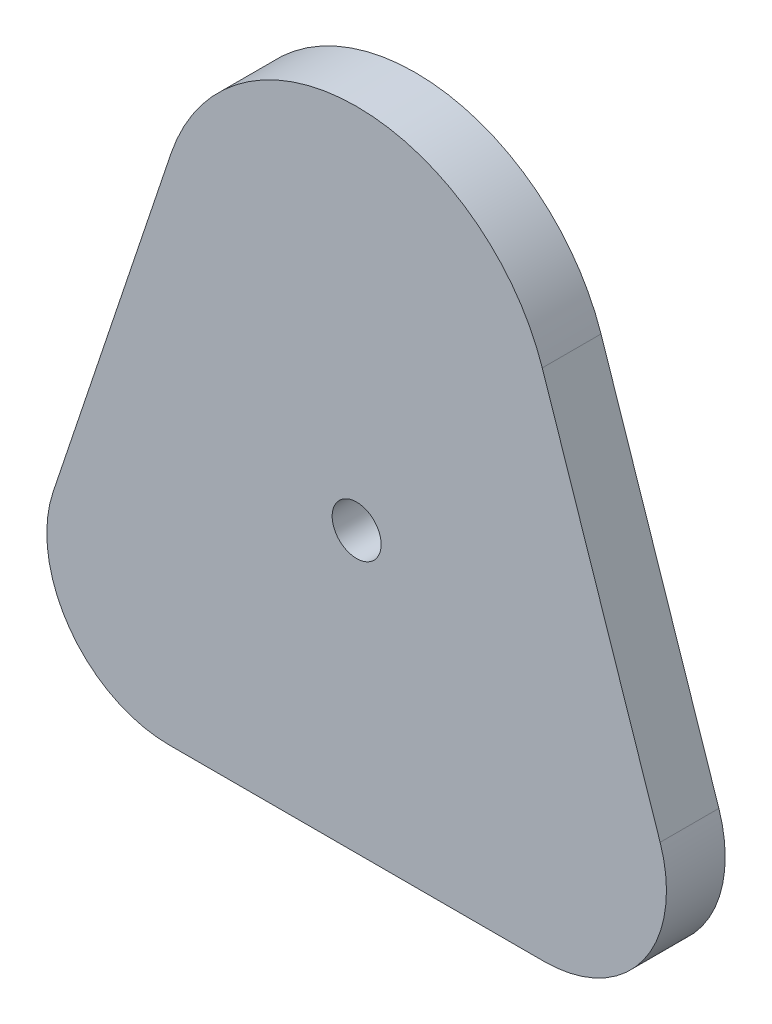
ISO-10303-21;
HEADER;
FILE_DESCRIPTION(('STEP AP214'),'2;1');
FILE_NAME('part.step','',(''),(''),'','','');
FILE_SCHEMA(('AUTOMOTIVE_DESIGN { 1 0 10303 214 1 1 1 1 }'));
ENDSEC;
DATA;
#1=APPLICATION_CONTEXT('core data for automotive mechanical design processes');
#2=APPLICATION_PROTOCOL_DEFINITION('international standard','automotive_design',2000,#1);
#3=PRODUCT_CONTEXT('',#1,'mechanical');
#4=PRODUCT('Part','Part','',(#3));
#5=PRODUCT_RELATED_PRODUCT_CATEGORY('part','',(#4));
#6=PRODUCT_DEFINITION_FORMATION('','',#4);
#7=PRODUCT_DEFINITION_CONTEXT('part definition',#1,'design');
#8=PRODUCT_DEFINITION('design','',#6,#7);
#9=PRODUCT_DEFINITION_SHAPE('','',#8);
#10=(LENGTH_UNIT() NAMED_UNIT(*) SI_UNIT(.MILLI.,.METRE.));
#11=(NAMED_UNIT(*) PLANE_ANGLE_UNIT() SI_UNIT($,.RADIAN.));
#12=(NAMED_UNIT(*) SI_UNIT($,.STERADIAN.) SOLID_ANGLE_UNIT());
#13=UNCERTAINTY_MEASURE_WITH_UNIT(LENGTH_MEASURE(1.E-05),#10,'distance_accuracy_value','');
#14=(GEOMETRIC_REPRESENTATION_CONTEXT(3) GLOBAL_UNCERTAINTY_ASSIGNED_CONTEXT((#13)) GLOBAL_UNIT_ASSIGNED_CONTEXT((#10,
#11,#12)) REPRESENTATION_CONTEXT('',''));
#15=CARTESIAN_POINT('',(0.,0.,0.));
#16=DIRECTION('',(0.,0.,1.));
#17=DIRECTION('',(1.,0.,0.));
#18=AXIS2_PLACEMENT_3D('',#15,#16,#17);
#19=CARTESIAN_POINT('',(0.,17.5,6.));
#20=DIRECTION('',(0.,0.,-1.));
#21=DIRECTION('',(-1.,0.,0.));
#22=AXIS2_PLACEMENT_3D('',#19,#20,#21);
#23=CYLINDRICAL_SURFACE('',#22,20.);
#24=CARTESIAN_POINT('',(0.,17.5,0.));
#25=DIRECTION('',(0.,0.,1.));
#26=DIRECTION('',(1.,0.,0.));
#27=AXIS2_PLACEMENT_3D('',#24,#25,#26);
#28=CIRCLE('',#27,20.);
#29=CARTESIAN_POINT('',(18.9648601114539,23.8509118205959,0.));
#30=VERTEX_POINT('',#29);
#31=CARTESIAN_POINT('',(-18.9648601114539,23.850911820596,0.));
#32=VERTEX_POINT('',#31);
#33=EDGE_CURVE('E126',#30,#32,#28,.T.);
#34=ORIENTED_EDGE('',*,*,#33,.T.);
#35=DIRECTION('',(0.,0.,-1.));
#36=VECTOR('',#35,1.);
#37=CARTESIAN_POINT('',(-18.9648601114539,23.850911820596,6.));
#38=LINE('',#37,#36);
#39=CARTESIAN_POINT('',(-18.9648601114539,23.850911820596,6.));
#40=VERTEX_POINT('',#39);
#41=EDGE_CURVE('E11',#40,#32,#38,.T.);
#42=ORIENTED_EDGE('',*,*,#41,.F.);
#43=CARTESIAN_POINT('',(0.,17.5,6.));
#44=DIRECTION('',(0.,0.,1.));
#45=DIRECTION('',(1.,0.,0.));
#46=AXIS2_PLACEMENT_3D('',#43,#44,#45);
#47=CIRCLE('',#46,20.);
#48=CARTESIAN_POINT('',(18.9648601114539,23.8509118205959,6.));
#49=VERTEX_POINT('',#48);
#50=EDGE_CURVE('E140',#49,#40,#47,.T.);
#51=ORIENTED_EDGE('',*,*,#50,.F.);
#52=DIRECTION('',(0.,0.,-1.));
#53=VECTOR('',#52,1.);
#54=CARTESIAN_POINT('',(18.9648601114539,23.8509118205959,6.));
#55=LINE('',#54,#53);
#56=EDGE_CURVE('E57',#49,#30,#55,.T.);
#57=ORIENTED_EDGE('',*,*,#56,.T.);
#58=EDGE_LOOP('',(#34,#42,#51,#57));
#59=FACE_BOUND('',#58,.T.);
#60=ADVANCED_FACE('F41',(#59),#23,.T.);
#61=CARTESIAN_POINT('',(-24.2342918602318,8.11552786228914,6.));
#62=DIRECTION('',(0.948243005572693,-0.3175455910298,0.));
#63=DIRECTION('',(0.3175455910298,0.948243005572694,0.));
#64=AXIS2_PLACEMENT_3D('',#61,#62,#63);
#65=PLANE('',#64);
#66=DIRECTION('',(-0.3175455910298,-0.948243005572694,0.));
#67=VECTOR('',#66,1.);
#68=CARTESIAN_POINT('',(-24.2342918602318,8.11552786228914,0.));
#69=LINE('',#68,#67);
#70=CARTESIAN_POINT('',(-31.0041486476332,-12.1003703542909,0.));
#71=VERTEX_POINT('',#70);
#72=EDGE_CURVE('E128',#32,#71,#69,.T.);
#73=ORIENTED_EDGE('',*,*,#72,.T.);
#74=DIRECTION('',(0.,0.,-1.));
#75=VECTOR('',#74,1.);
#76=CARTESIAN_POINT('',(-31.0041486476332,-12.1003703542909,6.));
#77=LINE('',#76,#75);
#78=CARTESIAN_POINT('',(-31.0041486476332,-12.1003703542909,6.));
#79=VERTEX_POINT('',#78);
#80=EDGE_CURVE('E49',#79,#71,#77,.T.);
#81=ORIENTED_EDGE('',*,*,#80,.F.);
#82=DIRECTION('',(-0.3175455910298,-0.948243005572694,0.));
#83=VECTOR('',#82,1.);
#84=CARTESIAN_POINT('',(-24.2342918602318,8.11552786228914,6.));
#85=LINE('',#84,#83);
#86=EDGE_CURVE('E90',#40,#79,#85,.T.);
#87=ORIENTED_EDGE('',*,*,#86,.F.);
#88=ORIENTED_EDGE('',*,*,#41,.T.);
#89=EDGE_LOOP('',(#73,#81,#87,#88));
#90=FACE_BOUND('',#89,.T.);
#91=ADVANCED_FACE('F161',(#90),#65,.F.);
#92=CARTESIAN_POINT('',(-19.1511110779745,-16.0696902421634,6.));
#93=DIRECTION('',(0.,0.,-1.));
#94=DIRECTION('',(-1.,0.,0.));
#95=AXIS2_PLACEMENT_3D('',#92,#93,#94);
#96=CYLINDRICAL_SURFACE('',#95,12.5);
#97=CARTESIAN_POINT('',(-19.1511110779745,-16.0696902421634,0.));
#98=DIRECTION('',(0.,0.,1.));
#99=DIRECTION('',(1.,0.,0.));
#100=AXIS2_PLACEMENT_3D('',#97,#98,#99);
#101=CIRCLE('',#100,12.5);
#102=CARTESIAN_POINT('',(-19.1511110779746,-28.5696902421634,0.));
#103=VERTEX_POINT('',#102);
#104=EDGE_CURVE('E131',#71,#103,#101,.T.);
#105=ORIENTED_EDGE('',*,*,#104,.T.);
#106=DIRECTION('',(0.,0.,-1.));
#107=VECTOR('',#106,1.);
#108=CARTESIAN_POINT('',(-19.1511110779746,-28.5696902421634,6.));
#109=LINE('',#108,#107);
#110=CARTESIAN_POINT('',(-19.1511110779746,-28.5696902421634,6.));
#111=VERTEX_POINT('',#110);
#112=EDGE_CURVE('E109',#111,#103,#109,.T.);
#113=ORIENTED_EDGE('',*,*,#112,.F.);
#114=CARTESIAN_POINT('',(-19.1511110779745,-16.0696902421634,6.));
#115=DIRECTION('',(0.,0.,1.));
#116=DIRECTION('',(1.,0.,0.));
#117=AXIS2_PLACEMENT_3D('',#114,#115,#116);
#118=CIRCLE('',#117,12.5);
#119=EDGE_CURVE('E119',#79,#111,#118,.T.);
#120=ORIENTED_EDGE('',*,*,#119,.F.);
#121=ORIENTED_EDGE('',*,*,#80,.T.);
#122=EDGE_LOOP('',(#105,#113,#120,#121));
#123=FACE_BOUND('',#122,.T.);
#124=ADVANCED_FACE('F146',(#123),#96,.T.);
#125=CARTESIAN_POINT('',(-1.03514646565787E-13,-28.5696902421634,6.));
#126=DIRECTION('',(0.,-1.,0.));
#127=DIRECTION('',(1.,0.,0.));
#128=AXIS2_PLACEMENT_3D('',#125,#126,#127);
#129=PLANE('',#128);
#130=DIRECTION('',(-1.,0.,0.));
#131=VECTOR('',#130,1.);
#132=CARTESIAN_POINT('',(-1.03514646565787E-13,-28.5696902421634,0.));
#133=LINE('',#132,#131);
#134=CARTESIAN_POINT('',(19.1511110779744,-28.5696902421635,0.));
#135=VERTEX_POINT('',#134);
#136=EDGE_CURVE('E106',#135,#103,#133,.T.);
#137=ORIENTED_EDGE('',*,*,#136,.F.);
#138=DIRECTION('',(0.,0.,-1.));
#139=VECTOR('',#138,1.);
#140=CARTESIAN_POINT('',(19.1511110779744,-28.5696902421635,6.));
#141=LINE('',#140,#139);
#142=CARTESIAN_POINT('',(19.1511110779744,-28.5696902421635,6.));
#143=VERTEX_POINT('',#142);
#144=EDGE_CURVE('E100',#143,#135,#141,.T.);
#145=ORIENTED_EDGE('',*,*,#144,.F.);
#146=DIRECTION('',(-1.,0.,0.));
#147=VECTOR('',#146,1.);
#148=CARTESIAN_POINT('',(-1.03514646565787E-13,-28.5696902421634,6.));
#149=LINE('',#148,#147);
#150=EDGE_CURVE('E104',#143,#111,#149,.T.);
#151=ORIENTED_EDGE('',*,*,#150,.T.);
#152=ORIENTED_EDGE('',*,*,#112,.T.);
#153=EDGE_LOOP('',(#137,#145,#151,#152));
#154=FACE_BOUND('',#153,.T.);
#155=ADVANCED_FACE('F102',(#154),#129,.T.);
#156=CARTESIAN_POINT('',(19.1511110779744,-16.0696902421635,6.));
#157=DIRECTION('',(0.,0.,-1.));
#158=DIRECTION('',(-1.,0.,0.));
#159=AXIS2_PLACEMENT_3D('',#156,#157,#158);
#160=CYLINDRICAL_SURFACE('',#159,12.5);
#161=CARTESIAN_POINT('',(19.1511110779744,-16.0696902421635,0.));
#162=DIRECTION('',(0.,0.,1.));
#163=DIRECTION('',(1.,0.,0.));
#164=AXIS2_PLACEMENT_3D('',#161,#162,#163);
#165=CIRCLE('',#164,12.5);
#166=CARTESIAN_POINT('',(31.0041486476331,-12.1003703542911,0.));
#167=VERTEX_POINT('',#166);
#168=EDGE_CURVE('E135',#135,#167,#165,.T.);
#169=ORIENTED_EDGE('',*,*,#168,.T.);
#170=DIRECTION('',(0.,0.,-1.));
#171=VECTOR('',#170,1.);
#172=CARTESIAN_POINT('',(31.0041486476331,-12.1003703542911,6.));
#173=LINE('',#172,#171);
#174=CARTESIAN_POINT('',(31.0041486476331,-12.1003703542911,6.));
#175=VERTEX_POINT('',#174);
#176=EDGE_CURVE('E78',#175,#167,#173,.T.);
#177=ORIENTED_EDGE('',*,*,#176,.F.);
#178=CARTESIAN_POINT('',(19.1511110779744,-16.0696902421635,6.));
#179=DIRECTION('',(0.,0.,1.));
#180=DIRECTION('',(1.,0.,0.));
#181=AXIS2_PLACEMENT_3D('',#178,#179,#180);
#182=CIRCLE('',#181,12.5);
#183=EDGE_CURVE('E111',#143,#175,#182,.T.);
#184=ORIENTED_EDGE('',*,*,#183,.F.);
#185=ORIENTED_EDGE('',*,*,#144,.T.);
#186=EDGE_LOOP('',(#169,#177,#184,#185));
#187=FACE_BOUND('',#186,.T.);
#188=ADVANCED_FACE('F112',(#187),#160,.T.);
#189=CARTESIAN_POINT('',(24.2342918602318,8.11552786228902,6.));
#190=DIRECTION('',(0.948243005572695,0.317545591029796,0.));
#191=DIRECTION('',(-0.317545591029796,0.948243005572695,0.));
#192=AXIS2_PLACEMENT_3D('',#189,#190,#191);
#193=PLANE('',#192);
#194=DIRECTION('',(0.317545591029796,-0.948243005572695,0.));
#195=VECTOR('',#194,1.);
#196=CARTESIAN_POINT('',(24.2342918602318,8.11552786228902,0.));
#197=LINE('',#196,#195);
#198=EDGE_CURVE('E137',#30,#167,#197,.T.);
#199=ORIENTED_EDGE('',*,*,#198,.F.);
#200=ORIENTED_EDGE('',*,*,#56,.F.);
#201=DIRECTION('',(0.317545591029796,-0.948243005572695,0.));
#202=VECTOR('',#201,1.);
#203=CARTESIAN_POINT('',(24.2342918602318,8.11552786228902,6.));
#204=LINE('',#203,#202);
#205=EDGE_CURVE('E115',#49,#175,#204,.T.);
#206=ORIENTED_EDGE('',*,*,#205,.T.);
#207=ORIENTED_EDGE('',*,*,#176,.T.);
#208=EDGE_LOOP('',(#199,#200,#206,#207));
#209=FACE_BOUND('',#208,.T.);
#210=ADVANCED_FACE('F149',(#209),#193,.T.);
#211=CARTESIAN_POINT('',(0.,0.,6.));
#212=DIRECTION('',(0.,0.,1.));
#213=DIRECTION('',(1.,0.,0.));
#214=AXIS2_PLACEMENT_3D('',#211,#212,#213);
#215=PLANE('',#214);
#216=CARTESIAN_POINT('',(0.,0.,6.));
#217=DIRECTION('',(0.,0.,1.));
#218=DIRECTION('',(1.,0.,0.));
#219=AXIS2_PLACEMENT_3D('',#216,#217,#218);
#220=CIRCLE('',#219,2.5);
#221=CARTESIAN_POINT('',(2.5,0.,6.));
#222=VERTEX_POINT('',#221);
#223=EDGE_CURVE('E168',#222,#222,#220,.T.);
#224=ORIENTED_EDGE('',*,*,#223,.F.);
#225=EDGE_LOOP('',(#224));
#226=FACE_BOUND('',#225,.T.);
#227=ORIENTED_EDGE('',*,*,#50,.T.);
#228=ORIENTED_EDGE('',*,*,#86,.T.);
#229=ORIENTED_EDGE('',*,*,#119,.T.);
#230=ORIENTED_EDGE('',*,*,#150,.F.);
#231=ORIENTED_EDGE('',*,*,#183,.T.);
#232=ORIENTED_EDGE('',*,*,#205,.F.);
#233=EDGE_LOOP('',(#227,#228,#229,#230,#231,#232));
#234=FACE_BOUND('',#233,.T.);
#235=ADVANCED_FACE('F117',(#226,#234),#215,.T.);
#236=CARTESIAN_POINT('',(0.,0.,0.));
#237=DIRECTION('',(0.,0.,1.));
#238=DIRECTION('',(1.,0.,0.));
#239=AXIS2_PLACEMENT_3D('',#236,#237,#238);
#240=PLANE('',#239);
#241=CARTESIAN_POINT('',(0.,0.,0.));
#242=DIRECTION('',(0.,0.,1.));
#243=DIRECTION('',(1.,0.,0.));
#244=AXIS2_PLACEMENT_3D('',#241,#242,#243);
#245=CIRCLE('',#244,2.5);
#246=CARTESIAN_POINT('',(2.5,0.,0.));
#247=VERTEX_POINT('',#246);
#248=EDGE_CURVE('E129',#247,#247,#245,.T.);
#249=ORIENTED_EDGE('',*,*,#248,.T.);
#250=EDGE_LOOP('',(#249));
#251=FACE_BOUND('',#250,.T.);
#252=ORIENTED_EDGE('',*,*,#33,.F.);
#253=ORIENTED_EDGE('',*,*,#198,.T.);
#254=ORIENTED_EDGE('',*,*,#168,.F.);
#255=ORIENTED_EDGE('',*,*,#136,.T.);
#256=ORIENTED_EDGE('',*,*,#104,.F.);
#257=ORIENTED_EDGE('',*,*,#72,.F.);
#258=EDGE_LOOP('',(#252,#253,#254,#255,#256,#257));
#259=FACE_BOUND('',#258,.T.);
#260=ADVANCED_FACE('F148',(#251,#259),#240,.F.);
#261=CARTESIAN_POINT('',(0.,0.,0.));
#262=DIRECTION('',(0.,0.,1.));
#263=DIRECTION('',(1.,0.,0.));
#264=AXIS2_PLACEMENT_3D('',#261,#262,#263);
#265=CYLINDRICAL_SURFACE('',#264,2.5);
#266=ORIENTED_EDGE('',*,*,#248,.F.);
#267=EDGE_LOOP('',(#266));
#268=FACE_BOUND('',#267,.T.);
#269=ORIENTED_EDGE('',*,*,#223,.T.);
#270=EDGE_LOOP('',(#269));
#271=FACE_BOUND('',#270,.T.);
#272=ADVANCED_FACE('F175',(#268,#271),#265,.F.);
#273=CLOSED_SHELL('',(#60,#91,#124,#155,#188,#210,#235,#260,#272));
#274=MANIFOLD_SOLID_BREP('B2',#273);
#275=ADVANCED_BREP_SHAPE_REPRESENTATION('',(#18,#274),#14);
#276=SHAPE_DEFINITION_REPRESENTATION(#9,#275);
ENDSEC;
END-ISO-10303-21;
